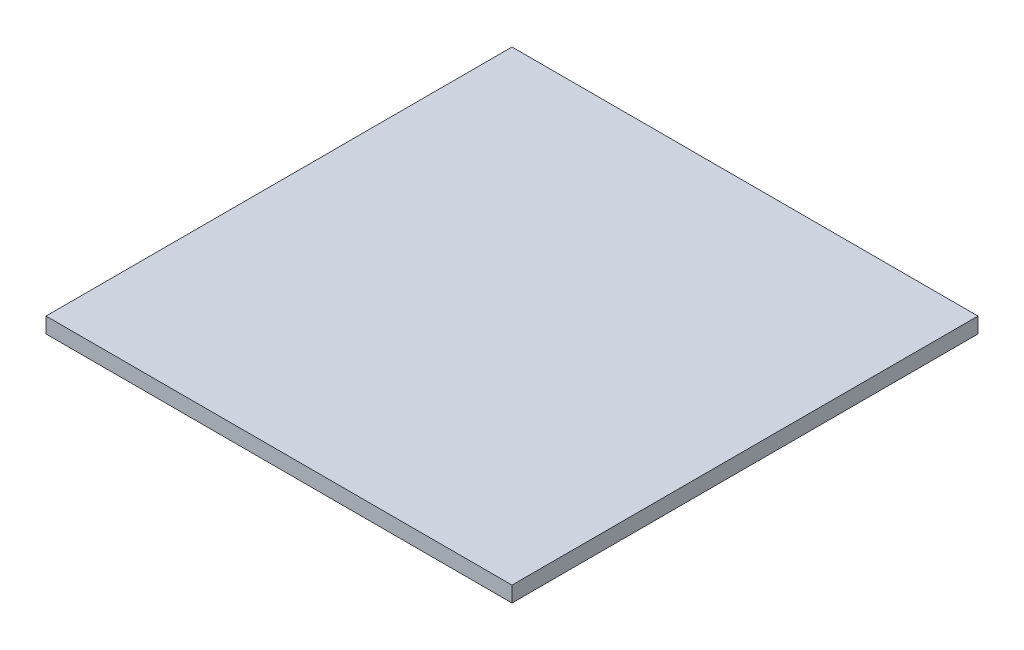
ISO-10303-21;
HEADER;
FILE_DESCRIPTION(('STEP AP214'),'2;1');
FILE_NAME('part.step','',(''),(''),'','','');
FILE_SCHEMA(('AUTOMOTIVE_DESIGN { 1 0 10303 214 1 1 1 1 }'));
ENDSEC;
DATA;
#1=APPLICATION_CONTEXT('core data for automotive mechanical design processes');
#2=APPLICATION_PROTOCOL_DEFINITION('international standard','automotive_design',2000,#1);
#3=PRODUCT_CONTEXT('',#1,'mechanical');
#4=PRODUCT('Part','Part','',(#3));
#5=PRODUCT_RELATED_PRODUCT_CATEGORY('part','',(#4));
#6=PRODUCT_DEFINITION_FORMATION('','',#4);
#7=PRODUCT_DEFINITION_CONTEXT('part definition',#1,'design');
#8=PRODUCT_DEFINITION('design','',#6,#7);
#9=PRODUCT_DEFINITION_SHAPE('','',#8);
#10=(LENGTH_UNIT() NAMED_UNIT(*) SI_UNIT(.MILLI.,.METRE.));
#11=(NAMED_UNIT(*) PLANE_ANGLE_UNIT() SI_UNIT($,.RADIAN.));
#12=(NAMED_UNIT(*) SI_UNIT($,.STERADIAN.) SOLID_ANGLE_UNIT());
#13=UNCERTAINTY_MEASURE_WITH_UNIT(LENGTH_MEASURE(1.E-05),#10,'distance_accuracy_value','');
#14=(GEOMETRIC_REPRESENTATION_CONTEXT(3) GLOBAL_UNCERTAINTY_ASSIGNED_CONTEXT((#13)) GLOBAL_UNIT_ASSIGNED_CONTEXT((#10,
#11,#12)) REPRESENTATION_CONTEXT('',''));
#15=CARTESIAN_POINT('',(0.,0.,0.));
#16=DIRECTION('',(0.,0.,1.));
#17=DIRECTION('',(1.,0.,0.));
#18=AXIS2_PLACEMENT_3D('',#15,#16,#17);
#19=CARTESIAN_POINT('',(150.,10.,150.));
#20=DIRECTION('',(-1.,0.,0.));
#21=DIRECTION('',(0.,0.,1.));
#22=AXIS2_PLACEMENT_3D('',#19,#20,#21);
#23=PLANE('',#22);
#24=DIRECTION('',(0.,0.,-1.));
#25=VECTOR('',#24,1.);
#26=CARTESIAN_POINT('',(150.,0.,150.));
#27=LINE('',#26,#25);
#28=CARTESIAN_POINT('',(150.,0.,150.));
#29=VERTEX_POINT('',#28);
#30=CARTESIAN_POINT('',(150.,0.,-150.));
#31=VERTEX_POINT('',#30);
#32=EDGE_CURVE('E103',#29,#31,#27,.T.);
#33=ORIENTED_EDGE('',*,*,#32,.T.);
#34=DIRECTION('',(0.,-1.,0.));
#35=VECTOR('',#34,1.);
#36=CARTESIAN_POINT('',(150.,10.,-150.));
#37=LINE('',#36,#35);
#38=CARTESIAN_POINT('',(150.,10.,-150.));
#39=VERTEX_POINT('',#38);
#40=EDGE_CURVE('E11',#39,#31,#37,.T.);
#41=ORIENTED_EDGE('',*,*,#40,.F.);
#42=DIRECTION('',(0.,0.,-1.));
#43=VECTOR('',#42,1.);
#44=CARTESIAN_POINT('',(150.,10.,150.));
#45=LINE('',#44,#43);
#46=CARTESIAN_POINT('',(150.,10.,150.));
#47=VERTEX_POINT('',#46);
#48=EDGE_CURVE('E91',#47,#39,#45,.T.);
#49=ORIENTED_EDGE('',*,*,#48,.F.);
#50=DIRECTION('',(0.,-1.,0.));
#51=VECTOR('',#50,1.);
#52=CARTESIAN_POINT('',(150.,10.,150.));
#53=LINE('',#52,#51);
#54=EDGE_CURVE('E99',#47,#29,#53,.T.);
#55=ORIENTED_EDGE('',*,*,#54,.T.);
#56=EDGE_LOOP('',(#33,#41,#49,#55));
#57=FACE_BOUND('',#56,.T.);
#58=ADVANCED_FACE('F40',(#57),#23,.F.);
#59=CARTESIAN_POINT('',(-150.,10.,-150.));
#60=DIRECTION('',(0.,0.,1.));
#61=DIRECTION('',(1.,0.,0.));
#62=AXIS2_PLACEMENT_3D('',#59,#60,#61);
#63=PLANE('',#62);
#64=DIRECTION('',(-1.,0.,0.));
#65=VECTOR('',#64,1.);
#66=CARTESIAN_POINT('',(-150.,0.,-150.));
#67=LINE('',#66,#65);
#68=CARTESIAN_POINT('',(-150.,0.,-150.));
#69=VERTEX_POINT('',#68);
#70=EDGE_CURVE('E95',#31,#69,#67,.T.);
#71=ORIENTED_EDGE('',*,*,#70,.T.);
#72=DIRECTION('',(0.,-1.,0.));
#73=VECTOR('',#72,1.);
#74=CARTESIAN_POINT('',(-150.,10.,-150.));
#75=LINE('',#74,#73);
#76=CARTESIAN_POINT('',(-150.,10.,-150.));
#77=VERTEX_POINT('',#76);
#78=EDGE_CURVE('E48',#77,#69,#75,.T.);
#79=ORIENTED_EDGE('',*,*,#78,.F.);
#80=DIRECTION('',(-1.,0.,0.));
#81=VECTOR('',#80,1.);
#82=CARTESIAN_POINT('',(-150.,10.,-150.));
#83=LINE('',#82,#81);
#84=EDGE_CURVE('E86',#39,#77,#83,.T.);
#85=ORIENTED_EDGE('',*,*,#84,.F.);
#86=ORIENTED_EDGE('',*,*,#40,.T.);
#87=EDGE_LOOP('',(#71,#79,#85,#86));
#88=FACE_BOUND('',#87,.T.);
#89=ADVANCED_FACE('F94',(#88),#63,.F.);
#90=CARTESIAN_POINT('',(-150.,10.,150.));
#91=DIRECTION('',(1.,0.,0.));
#92=DIRECTION('',(0.,0.,-1.));
#93=AXIS2_PLACEMENT_3D('',#90,#91,#92);
#94=PLANE('',#93);
#95=DIRECTION('',(0.,0.,1.));
#96=VECTOR('',#95,1.);
#97=CARTESIAN_POINT('',(-150.,0.,150.));
#98=LINE('',#97,#96);
#99=CARTESIAN_POINT('',(-150.,0.,150.));
#100=VERTEX_POINT('',#99);
#101=EDGE_CURVE('E73',#69,#100,#98,.T.);
#102=ORIENTED_EDGE('',*,*,#101,.T.);
#103=DIRECTION('',(0.,-1.,0.));
#104=VECTOR('',#103,1.);
#105=CARTESIAN_POINT('',(-150.,10.,150.));
#106=LINE('',#105,#104);
#107=CARTESIAN_POINT('',(-150.,10.,150.));
#108=VERTEX_POINT('',#107);
#109=EDGE_CURVE('E96',#108,#100,#106,.T.);
#110=ORIENTED_EDGE('',*,*,#109,.F.);
#111=DIRECTION('',(0.,0.,1.));
#112=VECTOR('',#111,1.);
#113=CARTESIAN_POINT('',(-150.,10.,150.));
#114=LINE('',#113,#112);
#115=EDGE_CURVE('E89',#77,#108,#114,.T.);
#116=ORIENTED_EDGE('',*,*,#115,.F.);
#117=ORIENTED_EDGE('',*,*,#78,.T.);
#118=EDGE_LOOP('',(#102,#110,#116,#117));
#119=FACE_BOUND('',#118,.T.);
#120=ADVANCED_FACE('F97',(#119),#94,.F.);
#121=CARTESIAN_POINT('',(-150.,10.,150.));
#122=DIRECTION('',(0.,0.,-1.));
#123=DIRECTION('',(-1.,0.,0.));
#124=AXIS2_PLACEMENT_3D('',#121,#122,#123);
#125=PLANE('',#124);
#126=DIRECTION('',(1.,0.,0.));
#127=VECTOR('',#126,1.);
#128=CARTESIAN_POINT('',(-150.,0.,150.));
#129=LINE('',#128,#127);
#130=EDGE_CURVE('E79',#100,#29,#129,.T.);
#131=ORIENTED_EDGE('',*,*,#130,.T.);
#132=ORIENTED_EDGE('',*,*,#54,.F.);
#133=DIRECTION('',(1.,0.,0.));
#134=VECTOR('',#133,1.);
#135=CARTESIAN_POINT('',(-150.,10.,150.));
#136=LINE('',#135,#134);
#137=EDGE_CURVE('E56',#108,#47,#136,.T.);
#138=ORIENTED_EDGE('',*,*,#137,.F.);
#139=ORIENTED_EDGE('',*,*,#109,.T.);
#140=EDGE_LOOP('',(#131,#132,#138,#139));
#141=FACE_BOUND('',#140,.T.);
#142=ADVANCED_FACE('F110',(#141),#125,.F.);
#143=CARTESIAN_POINT('',(0.,10.,0.));
#144=DIRECTION('',(0.,-1.,0.));
#145=DIRECTION('',(0.,0.,-1.));
#146=AXIS2_PLACEMENT_3D('',#143,#144,#145);
#147=PLANE('',#146);
#148=ORIENTED_EDGE('',*,*,#48,.T.);
#149=ORIENTED_EDGE('',*,*,#84,.T.);
#150=ORIENTED_EDGE('',*,*,#115,.T.);
#151=ORIENTED_EDGE('',*,*,#137,.T.);
#152=EDGE_LOOP('',(#148,#149,#150,#151));
#153=FACE_BOUND('',#152,.T.);
#154=ADVANCED_FACE('F87',(#153),#147,.F.);
#155=CARTESIAN_POINT('',(0.,0.,0.));
#156=DIRECTION('',(0.,-1.,0.));
#157=DIRECTION('',(0.,0.,-1.));
#158=AXIS2_PLACEMENT_3D('',#155,#156,#157);
#159=PLANE('',#158);
#160=ORIENTED_EDGE('',*,*,#32,.F.);
#161=ORIENTED_EDGE('',*,*,#130,.F.);
#162=ORIENTED_EDGE('',*,*,#101,.F.);
#163=ORIENTED_EDGE('',*,*,#70,.F.);
#164=EDGE_LOOP('',(#160,#161,#162,#163));
#165=FACE_BOUND('',#164,.T.);
#166=ADVANCED_FACE('F113',(#165),#159,.T.);
#167=CLOSED_SHELL('',(#58,#89,#120,#142,#154,#166));
#168=MANIFOLD_SOLID_BREP('B2',#167);
#169=ADVANCED_BREP_SHAPE_REPRESENTATION('',(#18,#168),#14);
#170=SHAPE_DEFINITION_REPRESENTATION(#9,#169);
ENDSEC;
END-ISO-10303-21;
